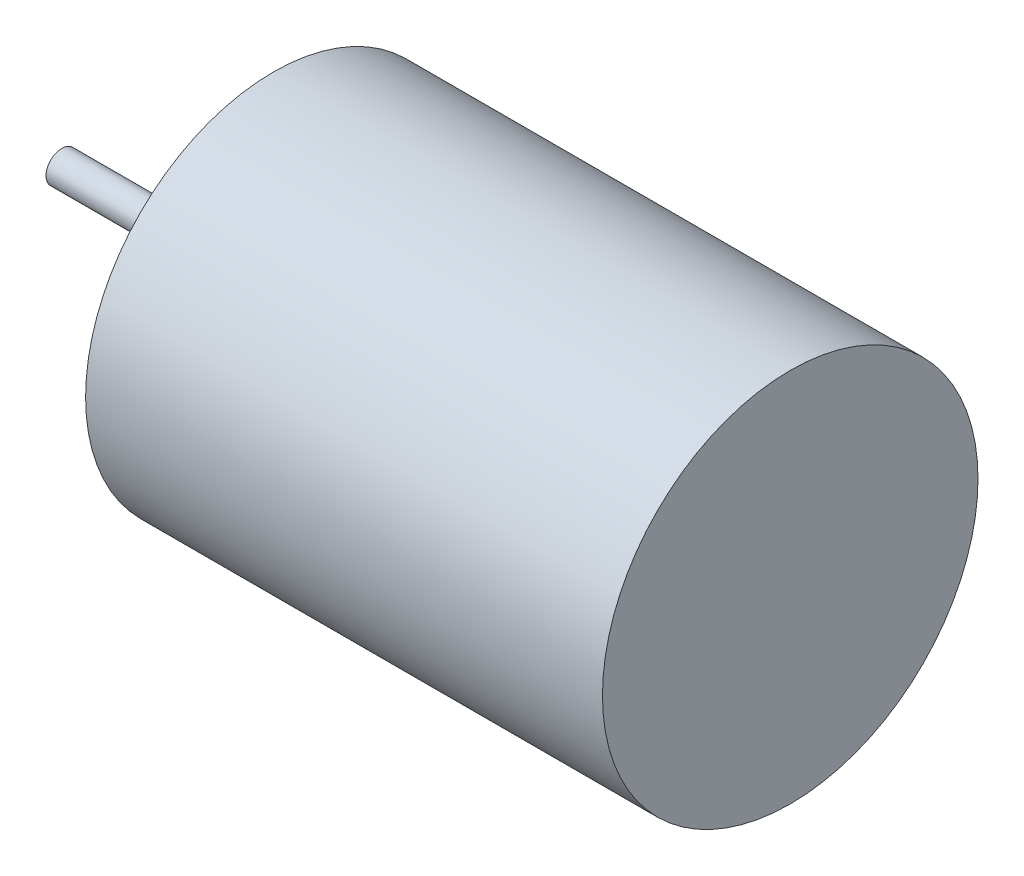
ISO-10303-21;
HEADER;
FILE_DESCRIPTION(('STEP AP214'),'2;1');
FILE_NAME('part.step','',(''),(''),'','','');
FILE_SCHEMA(('AUTOMOTIVE_DESIGN { 1 0 10303 214 1 1 1 1 }'));
ENDSEC;
DATA;
#1=APPLICATION_CONTEXT('core data for automotive mechanical design processes');
#2=APPLICATION_PROTOCOL_DEFINITION('international standard','automotive_design',2000,#1);
#3=PRODUCT_CONTEXT('',#1,'mechanical');
#4=PRODUCT('Part','Part','',(#3));
#5=PRODUCT_RELATED_PRODUCT_CATEGORY('part','',(#4));
#6=PRODUCT_DEFINITION_FORMATION('','',#4);
#7=PRODUCT_DEFINITION_CONTEXT('part definition',#1,'design');
#8=PRODUCT_DEFINITION('design','',#6,#7);
#9=PRODUCT_DEFINITION_SHAPE('','',#8);
#10=(LENGTH_UNIT() NAMED_UNIT(*) SI_UNIT(.MILLI.,.METRE.));
#11=(NAMED_UNIT(*) PLANE_ANGLE_UNIT() SI_UNIT($,.RADIAN.));
#12=(NAMED_UNIT(*) SI_UNIT($,.STERADIAN.) SOLID_ANGLE_UNIT());
#13=UNCERTAINTY_MEASURE_WITH_UNIT(LENGTH_MEASURE(1.E-05),#10,'distance_accuracy_value','');
#14=(GEOMETRIC_REPRESENTATION_CONTEXT(3) GLOBAL_UNCERTAINTY_ASSIGNED_CONTEXT((#13)) GLOBAL_UNIT_ASSIGNED_CONTEXT((#10,
#11,#12)) REPRESENTATION_CONTEXT('',''));
#15=CARTESIAN_POINT('',(0.,0.,0.));
#16=DIRECTION('',(0.,0.,1.));
#17=DIRECTION('',(1.,0.,0.));
#18=AXIS2_PLACEMENT_3D('',#15,#16,#17);
#19=CARTESIAN_POINT('',(0.,0.,0.));
#20=DIRECTION('',(1.,0.,0.));
#21=DIRECTION('',(0.,0.,-1.));
#22=AXIS2_PLACEMENT_3D('',#19,#20,#21);
#23=PLANE('',#22);
#24=CARTESIAN_POINT('',(0.,0.,0.));
#25=DIRECTION('',(-1.,0.,0.));
#26=DIRECTION('',(0.,0.,1.));
#27=AXIS2_PLACEMENT_3D('',#24,#25,#26);
#28=CIRCLE('',#27,1.15);
#29=CARTESIAN_POINT('',(0.,0.,1.15));
#30=VERTEX_POINT('',#29);
#31=EDGE_CURVE('E10',#30,#30,#28,.T.);
#32=ORIENTED_EDGE('',*,*,#31,.T.);
#33=EDGE_LOOP('',(#32));
#34=FACE_BOUND('',#33,.T.);
#35=ADVANCED_FACE('F34',(#34),#23,.F.);
#36=CARTESIAN_POINT('',(-15.2154016602707,0.,0.));
#37=DIRECTION('',(-1.,0.,0.));
#38=DIRECTION('',(0.,0.,1.));
#39=AXIS2_PLACEMENT_3D('',#36,#37,#38);
#40=CYLINDRICAL_SURFACE('',#39,1.15);
#41=ORIENTED_EDGE('',*,*,#31,.F.);
#42=EDGE_LOOP('',(#41));
#43=FACE_BOUND('',#42,.T.);
#44=CARTESIAN_POINT('',(13.,0.,0.));
#45=DIRECTION('',(-1.,0.,0.));
#46=DIRECTION('',(0.,0.,1.));
#47=AXIS2_PLACEMENT_3D('',#44,#45,#46);
#48=CIRCLE('',#47,1.15);
#49=CARTESIAN_POINT('',(13.,0.,1.15));
#50=VERTEX_POINT('',#49);
#51=EDGE_CURVE('E40',#50,#50,#48,.T.);
#52=ORIENTED_EDGE('',*,*,#51,.T.);
#53=EDGE_LOOP('',(#52));
#54=FACE_BOUND('',#53,.T.);
#55=ADVANCED_FACE('F72',(#43,#54),#40,.T.);
#56=CARTESIAN_POINT('',(13.,1.15,0.));
#57=DIRECTION('',(1.,0.,0.));
#58=DIRECTION('',(0.,0.,-1.));
#59=AXIS2_PLACEMENT_3D('',#56,#57,#58);
#60=PLANE('',#59);
#61=ORIENTED_EDGE('',*,*,#51,.F.);
#62=EDGE_LOOP('',(#61));
#63=FACE_BOUND('',#62,.T.);
#64=CARTESIAN_POINT('',(13.,0.,0.));
#65=DIRECTION('',(-1.,0.,0.));
#66=DIRECTION('',(0.,0.,1.));
#67=AXIS2_PLACEMENT_3D('',#64,#65,#66);
#68=CIRCLE('',#67,4.95);
#69=CARTESIAN_POINT('',(13.,0.,4.95));
#70=VERTEX_POINT('',#69);
#71=EDGE_CURVE('E44',#70,#70,#68,.T.);
#72=ORIENTED_EDGE('',*,*,#71,.T.);
#73=EDGE_LOOP('',(#72));
#74=FACE_BOUND('',#73,.T.);
#75=ADVANCED_FACE('F76',(#63,#74),#60,.F.);
#76=CARTESIAN_POINT('',(-15.2154016602707,0.,0.));
#77=DIRECTION('',(-1.,0.,0.));
#78=DIRECTION('',(0.,0.,1.));
#79=AXIS2_PLACEMENT_3D('',#76,#77,#78);
#80=CYLINDRICAL_SURFACE('',#79,4.95);
#81=ORIENTED_EDGE('',*,*,#71,.F.);
#82=EDGE_LOOP('',(#81));
#83=FACE_BOUND('',#82,.T.);
#84=CARTESIAN_POINT('',(15.5,0.,0.));
#85=DIRECTION('',(-1.,0.,0.));
#86=DIRECTION('',(0.,0.,1.));
#87=AXIS2_PLACEMENT_3D('',#84,#85,#86);
#88=CIRCLE('',#87,4.95);
#89=CARTESIAN_POINT('',(15.5,0.,4.95));
#90=VERTEX_POINT('',#89);
#91=EDGE_CURVE('E48',#90,#90,#88,.T.);
#92=ORIENTED_EDGE('',*,*,#91,.T.);
#93=EDGE_LOOP('',(#92));
#94=FACE_BOUND('',#93,.T.);
#95=ADVANCED_FACE('F81',(#83,#94),#80,.T.);
#96=CARTESIAN_POINT('',(15.5,4.95,0.));
#97=DIRECTION('',(1.,0.,0.));
#98=DIRECTION('',(0.,0.,-1.));
#99=AXIS2_PLACEMENT_3D('',#96,#97,#98);
#100=PLANE('',#99);
#101=ORIENTED_EDGE('',*,*,#91,.F.);
#102=EDGE_LOOP('',(#101));
#103=FACE_BOUND('',#102,.T.);
#104=CARTESIAN_POINT('',(15.5,0.,0.));
#105=DIRECTION('',(-1.,0.,0.));
#106=DIRECTION('',(0.,0.,1.));
#107=AXIS2_PLACEMENT_3D('',#104,#105,#106);
#108=CIRCLE('',#107,13.75);
#109=CARTESIAN_POINT('',(15.5,0.,13.75));
#110=VERTEX_POINT('',#109);
#111=EDGE_CURVE('E53',#110,#110,#108,.T.);
#112=ORIENTED_EDGE('',*,*,#111,.T.);
#113=EDGE_LOOP('',(#112));
#114=FACE_BOUND('',#113,.T.);
#115=ADVANCED_FACE('F68',(#103,#114),#100,.F.);
#116=CARTESIAN_POINT('',(-15.2154016602707,0.,0.));
#117=DIRECTION('',(-1.,0.,0.));
#118=DIRECTION('',(0.,0.,1.));
#119=AXIS2_PLACEMENT_3D('',#116,#117,#118);
#120=CYLINDRICAL_SURFACE('',#119,13.75);
#121=ORIENTED_EDGE('',*,*,#111,.F.);
#122=EDGE_LOOP('',(#121));
#123=FACE_BOUND('',#122,.T.);
#124=CARTESIAN_POINT('',(53.35,0.,0.));
#125=DIRECTION('',(-1.,0.,0.));
#126=DIRECTION('',(0.,0.,1.));
#127=AXIS2_PLACEMENT_3D('',#124,#125,#126);
#128=CIRCLE('',#127,13.75);
#129=CARTESIAN_POINT('',(53.35,0.,13.75));
#130=VERTEX_POINT('',#129);
#131=EDGE_CURVE('E56',#130,#130,#128,.T.);
#132=ORIENTED_EDGE('',*,*,#131,.T.);
#133=EDGE_LOOP('',(#132));
#134=FACE_BOUND('',#133,.T.);
#135=ADVANCED_FACE('F60',(#123,#134),#120,.T.);
#136=CARTESIAN_POINT('',(53.35,4.75219094718927,0.));
#137=DIRECTION('',(-1.,0.,0.));
#138=DIRECTION('',(0.,0.,1.));
#139=AXIS2_PLACEMENT_3D('',#136,#137,#138);
#140=PLANE('',#139);
#141=ORIENTED_EDGE('',*,*,#131,.F.);
#142=EDGE_LOOP('',(#141));
#143=FACE_BOUND('',#142,.T.);
#144=ADVANCED_FACE('F62',(#143),#140,.F.);
#145=CLOSED_SHELL('',(#35,#55,#75,#95,#115,#135,#144));
#146=MANIFOLD_SOLID_BREP('B2',#145);
#147=ADVANCED_BREP_SHAPE_REPRESENTATION('',(#18,#146),#14);
#148=SHAPE_DEFINITION_REPRESENTATION(#9,#147);
ENDSEC;
END-ISO-10303-21;
